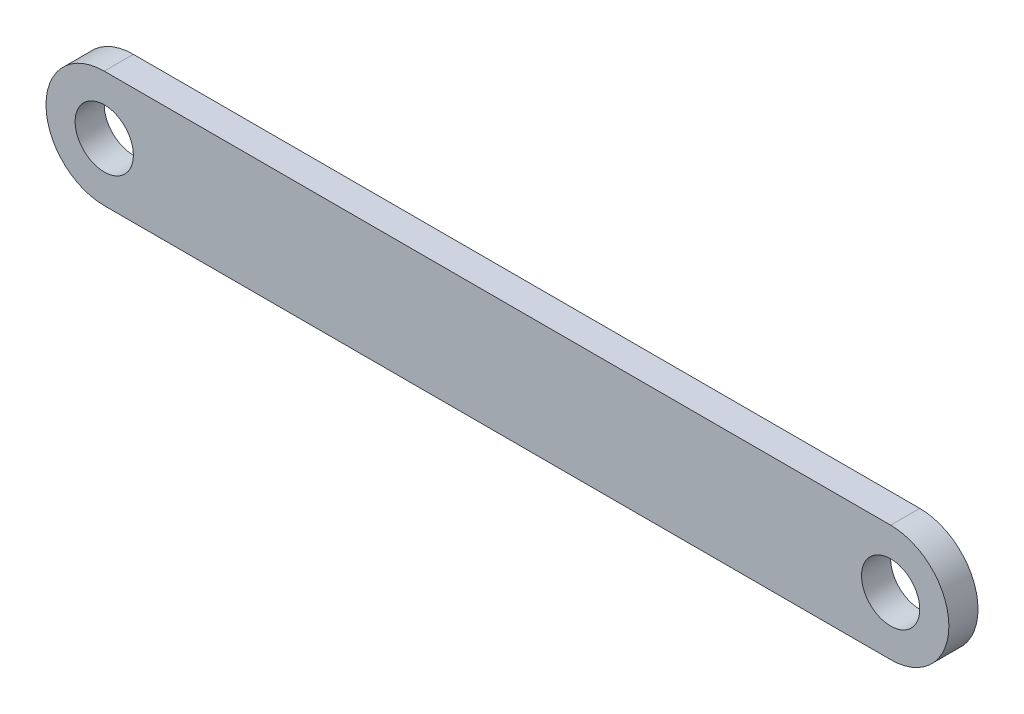
ISO-10303-21;
HEADER;
FILE_DESCRIPTION(('STEP AP214'),'2;1');
FILE_NAME('part.step','',(''),(''),'','','');
FILE_SCHEMA(('AUTOMOTIVE_DESIGN { 1 0 10303 214 1 1 1 1 }'));
ENDSEC;
DATA;
#1=APPLICATION_CONTEXT('core data for automotive mechanical design processes');
#2=APPLICATION_PROTOCOL_DEFINITION('international standard','automotive_design',2000,#1);
#3=PRODUCT_CONTEXT('',#1,'mechanical');
#4=PRODUCT('Part','Part','',(#3));
#5=PRODUCT_RELATED_PRODUCT_CATEGORY('part','',(#4));
#6=PRODUCT_DEFINITION_FORMATION('','',#4);
#7=PRODUCT_DEFINITION_CONTEXT('part definition',#1,'design');
#8=PRODUCT_DEFINITION('design','',#6,#7);
#9=PRODUCT_DEFINITION_SHAPE('','',#8);
#10=(LENGTH_UNIT() NAMED_UNIT(*) SI_UNIT(.MILLI.,.METRE.));
#11=(NAMED_UNIT(*) PLANE_ANGLE_UNIT() SI_UNIT($,.RADIAN.));
#12=(NAMED_UNIT(*) SI_UNIT($,.STERADIAN.) SOLID_ANGLE_UNIT());
#13=UNCERTAINTY_MEASURE_WITH_UNIT(LENGTH_MEASURE(1.E-05),#10,'distance_accuracy_value','');
#14=(GEOMETRIC_REPRESENTATION_CONTEXT(3) GLOBAL_UNCERTAINTY_ASSIGNED_CONTEXT((#13)) GLOBAL_UNIT_ASSIGNED_CONTEXT((#10,
#11,#12)) REPRESENTATION_CONTEXT('',''));
#15=CARTESIAN_POINT('',(0.,0.,0.));
#16=DIRECTION('',(0.,0.,1.));
#17=DIRECTION('',(1.,0.,0.));
#18=AXIS2_PLACEMENT_3D('',#15,#16,#17);
#19=CARTESIAN_POINT('',(-67.5,0.,5.));
#20=DIRECTION('',(0.,0.,1.));
#21=DIRECTION('',(1.,0.,0.));
#22=AXIS2_PLACEMENT_3D('',#19,#20,#21);
#23=PLANE('',#22);
#24=CARTESIAN_POINT('',(67.5,0.,5.));
#25=DIRECTION('',(0.,0.,1.));
#26=DIRECTION('',(1.,0.,0.));
#27=AXIS2_PLACEMENT_3D('',#24,#25,#26);
#28=CIRCLE('',#27,5.);
#29=CARTESIAN_POINT('',(72.5,0.,5.));
#30=VERTEX_POINT('',#29);
#31=EDGE_CURVE('E120',#30,#30,#28,.T.);
#32=ORIENTED_EDGE('',*,*,#31,.F.);
#33=EDGE_LOOP('',(#32));
#34=FACE_BOUND('',#33,.T.);
#35=CARTESIAN_POINT('',(-67.5,0.,5.));
#36=DIRECTION('',(0.,0.,1.));
#37=DIRECTION('',(1.,0.,0.));
#38=AXIS2_PLACEMENT_3D('',#35,#36,#37);
#39=CIRCLE('',#38,10.);
#40=CARTESIAN_POINT('',(-67.5,10.,5.));
#41=VERTEX_POINT('',#40);
#42=CARTESIAN_POINT('',(-67.5,-10.,5.));
#43=VERTEX_POINT('',#42);
#44=EDGE_CURVE('E97',#41,#43,#39,.T.);
#45=ORIENTED_EDGE('',*,*,#44,.T.);
#46=DIRECTION('',(1.,0.,0.));
#47=VECTOR('',#46,1.);
#48=CARTESIAN_POINT('',(-67.5,-10.,5.));
#49=LINE('',#48,#47);
#50=CARTESIAN_POINT('',(67.5,-9.99999999999998,5.));
#51=VERTEX_POINT('',#50);
#52=EDGE_CURVE('E93',#43,#51,#49,.T.);
#53=ORIENTED_EDGE('',*,*,#52,.T.);
#54=CARTESIAN_POINT('',(67.5,0.,5.));
#55=DIRECTION('',(0.,0.,1.));
#56=DIRECTION('',(1.,0.,0.));
#57=AXIS2_PLACEMENT_3D('',#54,#55,#56);
#58=CIRCLE('',#57,10.);
#59=CARTESIAN_POINT('',(67.5,10.,5.));
#60=VERTEX_POINT('',#59);
#61=EDGE_CURVE('E96',#51,#60,#58,.T.);
#62=ORIENTED_EDGE('',*,*,#61,.T.);
#63=DIRECTION('',(-1.,0.,0.));
#64=VECTOR('',#63,1.);
#65=CARTESIAN_POINT('',(-67.5,10.,5.));
#66=LINE('',#65,#64);
#67=EDGE_CURVE('E65',#60,#41,#66,.T.);
#68=ORIENTED_EDGE('',*,*,#67,.T.);
#69=EDGE_LOOP('',(#45,#53,#62,#68));
#70=FACE_BOUND('',#69,.T.);
#71=CARTESIAN_POINT('',(-67.5,0.,5.));
#72=DIRECTION('',(0.,0.,1.));
#73=DIRECTION('',(1.,0.,0.));
#74=AXIS2_PLACEMENT_3D('',#71,#72,#73);
#75=CIRCLE('',#74,5.);
#76=CARTESIAN_POINT('',(-62.5,0.,5.));
#77=VERTEX_POINT('',#76);
#78=EDGE_CURVE('E139',#77,#77,#75,.T.);
#79=ORIENTED_EDGE('',*,*,#78,.F.);
#80=EDGE_LOOP('',(#79));
#81=FACE_BOUND('',#80,.T.);
#82=ADVANCED_FACE('F44',(#34,#70,#81),#23,.T.);
#83=CARTESIAN_POINT('',(-67.5,0.,0.));
#84=DIRECTION('',(0.,0.,1.));
#85=DIRECTION('',(1.,0.,0.));
#86=AXIS2_PLACEMENT_3D('',#83,#84,#85);
#87=PLANE('',#86);
#88=CARTESIAN_POINT('',(-67.5,0.,0.));
#89=DIRECTION('',(0.,0.,1.));
#90=DIRECTION('',(1.,0.,0.));
#91=AXIS2_PLACEMENT_3D('',#88,#89,#90);
#92=CIRCLE('',#91,10.);
#93=CARTESIAN_POINT('',(-67.5,10.,0.));
#94=VERTEX_POINT('',#93);
#95=CARTESIAN_POINT('',(-67.5,-10.,0.));
#96=VERTEX_POINT('',#95);
#97=EDGE_CURVE('E114',#94,#96,#92,.T.);
#98=ORIENTED_EDGE('',*,*,#97,.F.);
#99=DIRECTION('',(-1.,0.,0.));
#100=VECTOR('',#99,1.);
#101=CARTESIAN_POINT('',(-67.5,10.,0.));
#102=LINE('',#101,#100);
#103=CARTESIAN_POINT('',(67.5,10.,0.));
#104=VERTEX_POINT('',#103);
#105=EDGE_CURVE('E86',#104,#94,#102,.T.);
#106=ORIENTED_EDGE('',*,*,#105,.F.);
#107=CARTESIAN_POINT('',(67.5,0.,0.));
#108=DIRECTION('',(0.,0.,1.));
#109=DIRECTION('',(1.,0.,0.));
#110=AXIS2_PLACEMENT_3D('',#107,#108,#109);
#111=CIRCLE('',#110,10.);
#112=CARTESIAN_POINT('',(67.5,-9.99999999999998,0.));
#113=VERTEX_POINT('',#112);
#114=EDGE_CURVE('E79',#113,#104,#111,.T.);
#115=ORIENTED_EDGE('',*,*,#114,.F.);
#116=DIRECTION('',(1.,0.,0.));
#117=VECTOR('',#116,1.);
#118=CARTESIAN_POINT('',(-67.5,-10.,0.));
#119=LINE('',#118,#117);
#120=EDGE_CURVE('E104',#96,#113,#119,.T.);
#121=ORIENTED_EDGE('',*,*,#120,.F.);
#122=EDGE_LOOP('',(#98,#106,#115,#121));
#123=FACE_BOUND('',#122,.T.);
#124=CARTESIAN_POINT('',(67.5,0.,0.));
#125=DIRECTION('',(0.,0.,1.));
#126=DIRECTION('',(1.,0.,0.));
#127=AXIS2_PLACEMENT_3D('',#124,#125,#126);
#128=CIRCLE('',#127,5.);
#129=CARTESIAN_POINT('',(72.5,0.,0.));
#130=VERTEX_POINT('',#129);
#131=EDGE_CURVE('E136',#130,#130,#128,.T.);
#132=ORIENTED_EDGE('',*,*,#131,.T.);
#133=EDGE_LOOP('',(#132));
#134=FACE_BOUND('',#133,.T.);
#135=CARTESIAN_POINT('',(-67.5,0.,0.));
#136=DIRECTION('',(0.,0.,1.));
#137=DIRECTION('',(1.,0.,0.));
#138=AXIS2_PLACEMENT_3D('',#135,#136,#137);
#139=CIRCLE('',#138,5.);
#140=CARTESIAN_POINT('',(-62.5,0.,0.));
#141=VERTEX_POINT('',#140);
#142=EDGE_CURVE('E143',#141,#141,#139,.T.);
#143=ORIENTED_EDGE('',*,*,#142,.T.);
#144=EDGE_LOOP('',(#143));
#145=FACE_BOUND('',#144,.T.);
#146=ADVANCED_FACE('F131',(#123,#134,#145),#87,.F.);
#147=CARTESIAN_POINT('',(-67.5,0.,5.));
#148=DIRECTION('',(0.,0.,-1.));
#149=DIRECTION('',(-1.,0.,0.));
#150=AXIS2_PLACEMENT_3D('',#147,#148,#149);
#151=CYLINDRICAL_SURFACE('',#150,10.);
#152=ORIENTED_EDGE('',*,*,#97,.T.);
#153=DIRECTION('',(0.,0.,-1.));
#154=VECTOR('',#153,1.);
#155=CARTESIAN_POINT('',(-67.5,-10.,5.));
#156=LINE('',#155,#154);
#157=EDGE_CURVE('E11',#43,#96,#156,.T.);
#158=ORIENTED_EDGE('',*,*,#157,.F.);
#159=ORIENTED_EDGE('',*,*,#44,.F.);
#160=DIRECTION('',(0.,0.,-1.));
#161=VECTOR('',#160,1.);
#162=CARTESIAN_POINT('',(-67.5,10.,5.));
#163=LINE('',#162,#161);
#164=EDGE_CURVE('E108',#41,#94,#163,.T.);
#165=ORIENTED_EDGE('',*,*,#164,.T.);
#166=EDGE_LOOP('',(#152,#158,#159,#165));
#167=FACE_BOUND('',#166,.T.);
#168=ADVANCED_FACE('F50',(#167),#151,.T.);
#169=CARTESIAN_POINT('',(-67.5,-10.,5.));
#170=DIRECTION('',(0.,1.,0.));
#171=DIRECTION('',(-1.,0.,0.));
#172=AXIS2_PLACEMENT_3D('',#169,#170,#171);
#173=PLANE('',#172);
#174=ORIENTED_EDGE('',*,*,#120,.T.);
#175=DIRECTION('',(0.,0.,-1.));
#176=VECTOR('',#175,1.);
#177=CARTESIAN_POINT('',(67.5,-9.99999999999998,5.));
#178=LINE('',#177,#176);
#179=EDGE_CURVE('E54',#51,#113,#178,.T.);
#180=ORIENTED_EDGE('',*,*,#179,.F.);
#181=ORIENTED_EDGE('',*,*,#52,.F.);
#182=ORIENTED_EDGE('',*,*,#157,.T.);
#183=EDGE_LOOP('',(#174,#180,#181,#182));
#184=FACE_BOUND('',#183,.T.);
#185=ADVANCED_FACE('F105',(#184),#173,.F.);
#186=CARTESIAN_POINT('',(67.5,0.,5.));
#187=DIRECTION('',(0.,0.,-1.));
#188=DIRECTION('',(-1.,0.,0.));
#189=AXIS2_PLACEMENT_3D('',#186,#187,#188);
#190=CYLINDRICAL_SURFACE('',#189,10.);
#191=ORIENTED_EDGE('',*,*,#114,.T.);
#192=DIRECTION('',(0.,0.,-1.));
#193=VECTOR('',#192,1.);
#194=CARTESIAN_POINT('',(67.5,10.,5.));
#195=LINE('',#194,#193);
#196=EDGE_CURVE('E103',#60,#104,#195,.T.);
#197=ORIENTED_EDGE('',*,*,#196,.F.);
#198=ORIENTED_EDGE('',*,*,#61,.F.);
#199=ORIENTED_EDGE('',*,*,#179,.T.);
#200=EDGE_LOOP('',(#191,#197,#198,#199));
#201=FACE_BOUND('',#200,.T.);
#202=ADVANCED_FACE('F107',(#201),#190,.T.);
#203=CARTESIAN_POINT('',(-67.5,10.,5.));
#204=DIRECTION('',(0.,-1.,0.));
#205=DIRECTION('',(1.,0.,0.));
#206=AXIS2_PLACEMENT_3D('',#203,#204,#205);
#207=PLANE('',#206);
#208=ORIENTED_EDGE('',*,*,#105,.T.);
#209=ORIENTED_EDGE('',*,*,#164,.F.);
#210=ORIENTED_EDGE('',*,*,#67,.F.);
#211=ORIENTED_EDGE('',*,*,#196,.T.);
#212=EDGE_LOOP('',(#208,#209,#210,#211));
#213=FACE_BOUND('',#212,.T.);
#214=ADVANCED_FACE('F126',(#213),#207,.F.);
#215=CARTESIAN_POINT('',(67.5,0.,5.));
#216=DIRECTION('',(0.,0.,-1.));
#217=DIRECTION('',(-1.,0.,0.));
#218=AXIS2_PLACEMENT_3D('',#215,#216,#217);
#219=CYLINDRICAL_SURFACE('',#218,5.);
#220=ORIENTED_EDGE('',*,*,#31,.T.);
#221=EDGE_LOOP('',(#220));
#222=FACE_BOUND('',#221,.T.);
#223=ORIENTED_EDGE('',*,*,#131,.F.);
#224=EDGE_LOOP('',(#223));
#225=FACE_BOUND('',#224,.T.);
#226=ADVANCED_FACE('F165',(#222,#225),#219,.F.);
#227=CARTESIAN_POINT('',(-67.5,0.,5.));
#228=DIRECTION('',(0.,0.,-1.));
#229=DIRECTION('',(-1.,0.,0.));
#230=AXIS2_PLACEMENT_3D('',#227,#228,#229);
#231=CYLINDRICAL_SURFACE('',#230,5.);
#232=ORIENTED_EDGE('',*,*,#78,.T.);
#233=EDGE_LOOP('',(#232));
#234=FACE_BOUND('',#233,.T.);
#235=ORIENTED_EDGE('',*,*,#142,.F.);
#236=EDGE_LOOP('',(#235));
#237=FACE_BOUND('',#236,.T.);
#238=ADVANCED_FACE('F154',(#234,#237),#231,.F.);
#239=CLOSED_SHELL('',(#82,#146,#168,#185,#202,#214,#226,#238));
#240=MANIFOLD_SOLID_BREP('B2',#239);
#241=ADVANCED_BREP_SHAPE_REPRESENTATION('',(#18,#240),#14);
#242=SHAPE_DEFINITION_REPRESENTATION(#9,#241);
ENDSEC;
END-ISO-10303-21;
